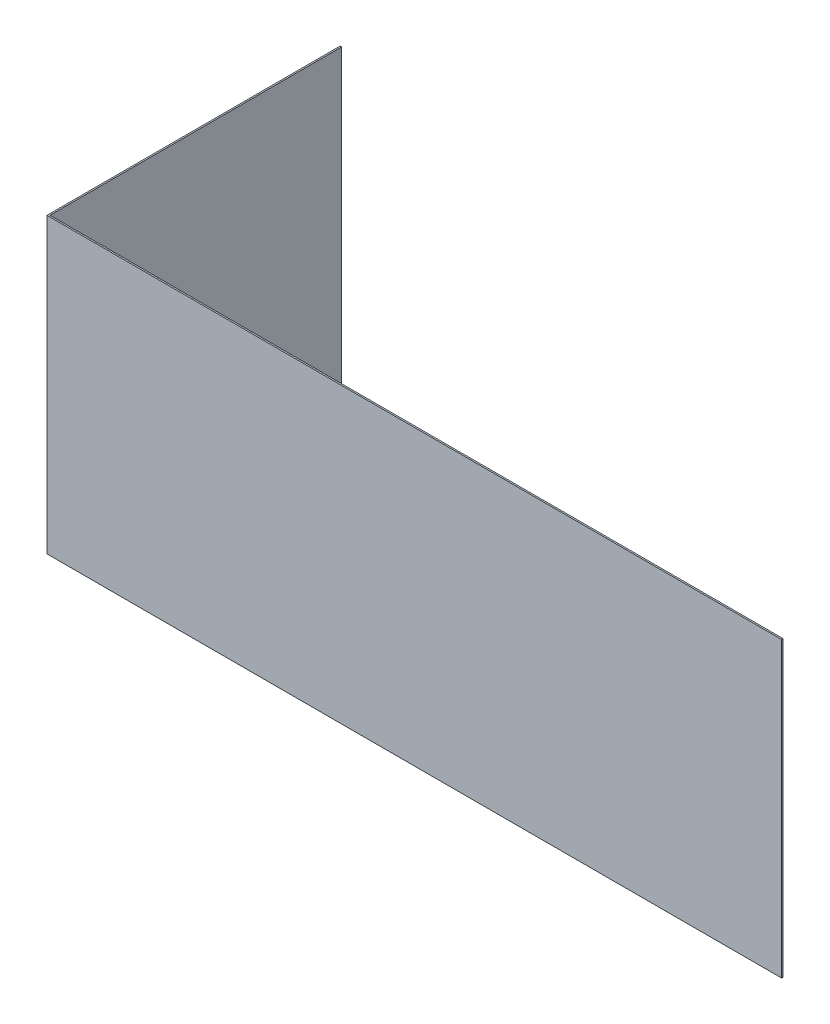
ISO-10303-21;
HEADER;
FILE_DESCRIPTION(('STEP AP214'),'2;1');
FILE_NAME('part.step','',(''),(''),'','','');
FILE_SCHEMA(('AUTOMOTIVE_DESIGN { 1 0 10303 214 1 1 1 1 }'));
ENDSEC;
DATA;
#1=APPLICATION_CONTEXT('core data for automotive mechanical design processes');
#2=APPLICATION_PROTOCOL_DEFINITION('international standard','automotive_design',2000,#1);
#3=PRODUCT_CONTEXT('',#1,'mechanical');
#4=PRODUCT('Part','Part','',(#3));
#5=PRODUCT_RELATED_PRODUCT_CATEGORY('part','',(#4));
#6=PRODUCT_DEFINITION_FORMATION('','',#4);
#7=PRODUCT_DEFINITION_CONTEXT('part definition',#1,'design');
#8=PRODUCT_DEFINITION('design','',#6,#7);
#9=PRODUCT_DEFINITION_SHAPE('','',#8);
#10=(LENGTH_UNIT() NAMED_UNIT(*) SI_UNIT(.MILLI.,.METRE.));
#11=(NAMED_UNIT(*) PLANE_ANGLE_UNIT() SI_UNIT($,.RADIAN.));
#12=(NAMED_UNIT(*) SI_UNIT($,.STERADIAN.) SOLID_ANGLE_UNIT());
#13=UNCERTAINTY_MEASURE_WITH_UNIT(LENGTH_MEASURE(1.E-05),#10,'distance_accuracy_value','');
#14=(GEOMETRIC_REPRESENTATION_CONTEXT(3) GLOBAL_UNCERTAINTY_ASSIGNED_CONTEXT((#13)) GLOBAL_UNIT_ASSIGNED_CONTEXT((#10,
#11,#12)) REPRESENTATION_CONTEXT('',''));
#15=CARTESIAN_POINT('',(0.,0.,0.));
#16=DIRECTION('',(0.,0.,1.));
#17=DIRECTION('',(1.,0.,0.));
#18=AXIS2_PLACEMENT_3D('',#15,#16,#17);
#19=CARTESIAN_POINT('',(9.81116109518429,6.11576115712928,-0.199998744702119));
#20=DIRECTION('',(0.,-8.74227339409092E-08,1.));
#21=DIRECTION('',(-8.74227764510149E-08,-1.,-8.74227339409088E-08));
#22=AXIS2_PLACEMENT_3D('',#19,#20,#21);
#23=PLANE('',#22);
#24=DIRECTION('',(-8.74227764510149E-08,-1.,-8.74227339409088E-08));
#25=VECTOR('',#24,1.);
#26=CARTESIAN_POINT('',(9.81116109518429,6.11576115712928,-0.199998744702119));
#27=LINE('',#26,#25);
#28=CARTESIAN_POINT('',(9.81116109518429,6.11576115712928,-0.199998744702119));
#29=VERTEX_POINT('',#28);
#30=CARTESIAN_POINT('',(9.81116107769975,5.91576115712927,-0.199998762186666));
#31=VERTEX_POINT('',#30);
#32=EDGE_CURVE('E137',#29,#31,#27,.T.);
#33=ORIENTED_EDGE('',*,*,#32,.T.);
#34=DIRECTION('',(-1.,8.74227764510146E-08,0.));
#35=VECTOR('',#34,1.);
#36=CARTESIAN_POINT('',(9.81116107769975,5.91576115712927,-0.199998762186666));
#37=LINE('',#36,#35);
#38=CARTESIAN_POINT('',(9.81016107769975,5.9157611572167,-0.199998762186666));
#39=VERTEX_POINT('',#38);
#40=EDGE_CURVE('E28',#31,#39,#37,.T.);
#41=ORIENTED_EDGE('',*,*,#40,.T.);
#42=DIRECTION('',(-8.74227764510149E-08,-1.,-8.74227339409088E-08));
#43=VECTOR('',#42,1.);
#44=CARTESIAN_POINT('',(9.81016109518429,6.11576115721671,-0.199998744702119));
#45=LINE('',#44,#43);
#46=CARTESIAN_POINT('',(9.81016109518429,6.11576115721671,-0.199998744702119));
#47=VERTEX_POINT('',#46);
#48=EDGE_CURVE('E11',#47,#39,#45,.T.);
#49=ORIENTED_EDGE('',*,*,#48,.F.);
#50=DIRECTION('',(-1.,8.74227764510146E-08,0.));
#51=VECTOR('',#50,1.);
#52=CARTESIAN_POINT('',(9.81016109518429,6.11576115721671,-0.199998744702119));
#53=LINE('',#52,#51);
#54=EDGE_CURVE('E140',#29,#47,#53,.T.);
#55=ORIENTED_EDGE('',*,*,#54,.F.);
#56=EDGE_LOOP('',(#33,#41,#49,#55));
#57=FACE_BOUND('',#56,.T.);
#58=ADVANCED_FACE('F17',(#57),#23,.F.);
#59=CARTESIAN_POINT('',(9.81016107769975,5.91576113973216,1.23781333316933E-06));
#60=DIRECTION('',(1.,-8.74227764510146E-08,0.));
#61=DIRECTION('',(8.74227764510149E-08,1.,8.74227339409088E-08));
#62=AXIS2_PLACEMENT_3D('',#59,#60,#61);
#63=PLANE('',#62);
#64=DIRECTION('',(8.74227764510149E-08,1.,8.74227339409088E-08));
#65=VECTOR('',#64,1.);
#66=CARTESIAN_POINT('',(9.81016107769975,5.91576113973216,1.23781333316933E-06));
#67=LINE('',#66,#65);
#68=CARTESIAN_POINT('',(9.81016107769975,5.91576113973216,1.23781333316933E-06));
#69=VERTEX_POINT('',#68);
#70=CARTESIAN_POINT('',(9.81016109518429,6.11576113973217,1.25529787996584E-06));
#71=VERTEX_POINT('',#70);
#72=EDGE_CURVE('E136',#69,#71,#67,.T.);
#73=ORIENTED_EDGE('',*,*,#72,.T.);
#74=DIRECTION('',(0.,8.74227339409092E-08,-1.));
#75=VECTOR('',#74,1.);
#76=CARTESIAN_POINT('',(9.81016109518429,6.11576113973217,1.25529787996584E-06));
#77=LINE('',#76,#75);
#78=EDGE_CURVE('E98',#71,#47,#77,.T.);
#79=ORIENTED_EDGE('',*,*,#78,.T.);
#80=ORIENTED_EDGE('',*,*,#48,.T.);
#81=DIRECTION('',(0.,8.74227339409092E-08,-1.));
#82=VECTOR('',#81,1.);
#83=CARTESIAN_POINT('',(9.81016107769975,5.91576113973216,1.23781333316933E-06));
#84=LINE('',#83,#82);
#85=EDGE_CURVE('E41',#69,#39,#84,.T.);
#86=ORIENTED_EDGE('',*,*,#85,.F.);
#87=EDGE_LOOP('',(#73,#79,#80,#86));
#88=FACE_BOUND('',#87,.T.);
#89=ADVANCED_FACE('F161',(#88),#63,.F.);
#90=CARTESIAN_POINT('',(9.81116109518429,6.11576113964474,1.25529787996584E-06));
#91=DIRECTION('',(1.,-8.74227764510145E-08,0.));
#92=DIRECTION('',(0.,-8.74227339409093E-08,1.));
#93=AXIS2_PLACEMENT_3D('',#90,#91,#92);
#94=PLANE('',#93);
#95=DIRECTION('',(0.,8.74227339409093E-08,-1.));
#96=VECTOR('',#95,1.);
#97=CARTESIAN_POINT('',(9.81116109518429,6.11576113964474,1.25529787996584E-06));
#98=LINE('',#97,#96);
#99=CARTESIAN_POINT('',(9.81116109518429,6.11576113973217,-0.000998744702120167));
#100=VERTEX_POINT('',#99);
#101=EDGE_CURVE('E150',#100,#29,#98,.T.);
#102=ORIENTED_EDGE('',*,*,#101,.F.);
#103=DIRECTION('',(8.74227764510149E-08,1.,8.74227339409088E-08));
#104=VECTOR('',#103,1.);
#105=CARTESIAN_POINT('',(9.81116109518429,6.11576113973217,-0.000998744702120167));
#106=LINE('',#105,#104);
#107=CARTESIAN_POINT('',(9.81116107769975,5.91576113973216,-0.000998762186666963));
#108=VERTEX_POINT('',#107);
#109=EDGE_CURVE('E153',#108,#100,#106,.T.);
#110=ORIENTED_EDGE('',*,*,#109,.F.);
#111=DIRECTION('',(0.,-8.74227339409093E-08,1.));
#112=VECTOR('',#111,1.);
#113=CARTESIAN_POINT('',(9.81116107769975,5.91576113964473,1.23781333316933E-06));
#114=LINE('',#113,#112);
#115=EDGE_CURVE('E141',#31,#108,#114,.T.);
#116=ORIENTED_EDGE('',*,*,#115,.F.);
#117=ORIENTED_EDGE('',*,*,#32,.F.);
#118=EDGE_LOOP('',(#102,#110,#116,#117));
#119=FACE_BOUND('',#118,.T.);
#120=ADVANCED_FACE('F181',(#119),#94,.T.);
#121=CARTESIAN_POINT('',(9.81016109518429,6.11576113981957,-0.000998744702120167));
#122=DIRECTION('',(0.,-8.74227339409092E-08,1.));
#123=DIRECTION('',(-1.,8.74227764510146E-08,0.));
#124=AXIS2_PLACEMENT_3D('',#121,#122,#123);
#125=PLANE('',#124);
#126=DIRECTION('',(-8.74227764510149E-08,-1.,-8.74227339409088E-08));
#127=VECTOR('',#126,1.);
#128=CARTESIAN_POINT('',(10.3111610951843,6.11576109602077,-0.000998744702123636));
#129=LINE('',#128,#127);
#130=CARTESIAN_POINT('',(10.3111610951843,6.11576109602077,-0.000998744702123636));
#131=VERTEX_POINT('',#130);
#132=CARTESIAN_POINT('',(10.3111610776997,5.91576109602077,-0.000998762186670433));
#133=VERTEX_POINT('',#132);
#134=EDGE_CURVE('E108',#131,#133,#129,.T.);
#135=ORIENTED_EDGE('',*,*,#134,.T.);
#136=DIRECTION('',(-1.,8.74227764510146E-08,0.));
#137=VECTOR('',#136,1.);
#138=CARTESIAN_POINT('',(10.3111610776997,5.91576109602077,-0.000998762186670433));
#139=LINE('',#138,#137);
#140=EDGE_CURVE('E75',#133,#108,#139,.T.);
#141=ORIENTED_EDGE('',*,*,#140,.T.);
#142=ORIENTED_EDGE('',*,*,#109,.T.);
#143=DIRECTION('',(1.,-8.74227764510146E-08,0.));
#144=VECTOR('',#143,1.);
#145=CARTESIAN_POINT('',(9.81016109518429,6.11576113981957,-0.000998744702120167));
#146=LINE('',#145,#144);
#147=EDGE_CURVE('E101',#100,#131,#146,.T.);
#148=ORIENTED_EDGE('',*,*,#147,.T.);
#149=EDGE_LOOP('',(#135,#141,#142,#148));
#150=FACE_BOUND('',#149,.T.);
#151=ADVANCED_FACE('F184',(#150),#125,.F.);
#152=CARTESIAN_POINT('',(9.81016109518429,6.11576113973217,1.25529787996584E-06));
#153=DIRECTION('',(0.,-8.74227339409092E-08,1.));
#154=DIRECTION('',(-1.,8.74227764510146E-08,0.));
#155=AXIS2_PLACEMENT_3D('',#152,#153,#154);
#156=PLANE('',#155);
#157=DIRECTION('',(1.,-8.74227764510146E-08,0.));
#158=VECTOR('',#157,1.);
#159=CARTESIAN_POINT('',(9.81016109518429,6.11576113973217,1.25529787996584E-06));
#160=LINE('',#159,#158);
#161=CARTESIAN_POINT('',(10.3111610951843,6.11576109593334,1.25529787606271E-06));
#162=VERTEX_POINT('',#161);
#163=EDGE_CURVE('E92',#71,#162,#160,.T.);
#164=ORIENTED_EDGE('',*,*,#163,.F.);
#165=ORIENTED_EDGE('',*,*,#72,.F.);
#166=DIRECTION('',(-1.,8.74227764510146E-08,0.));
#167=VECTOR('',#166,1.);
#168=CARTESIAN_POINT('',(10.3111610776997,5.91576109593336,1.2378133292662E-06));
#169=LINE('',#168,#167);
#170=CARTESIAN_POINT('',(10.3111610776997,5.91576109593336,1.2378133292662E-06));
#171=VERTEX_POINT('',#170);
#172=EDGE_CURVE('E86',#171,#69,#169,.T.);
#173=ORIENTED_EDGE('',*,*,#172,.F.);
#174=DIRECTION('',(-8.74227764510149E-08,-1.,-8.74227339409088E-08));
#175=VECTOR('',#174,1.);
#176=CARTESIAN_POINT('',(10.3111610951843,6.11576109593334,1.25529787606271E-06));
#177=LINE('',#176,#175);
#178=EDGE_CURVE('E107',#162,#171,#177,.T.);
#179=ORIENTED_EDGE('',*,*,#178,.F.);
#180=EDGE_LOOP('',(#164,#165,#173,#179));
#181=FACE_BOUND('',#180,.T.);
#182=ADVANCED_FACE('F111',(#181),#156,.T.);
#183=CARTESIAN_POINT('',(10.3111610776997,5.91576109593336,1.2378133292662E-06));
#184=DIRECTION('',(8.74227764510149E-08,1.,8.74227339409088E-08));
#185=DIRECTION('',(-1.,8.74227764510146E-08,0.));
#186=AXIS2_PLACEMENT_3D('',#183,#184,#185);
#187=PLANE('',#186);
#188=ORIENTED_EDGE('',*,*,#172,.T.);
#189=ORIENTED_EDGE('',*,*,#85,.T.);
#190=ORIENTED_EDGE('',*,*,#40,.F.);
#191=ORIENTED_EDGE('',*,*,#115,.T.);
#192=ORIENTED_EDGE('',*,*,#140,.F.);
#193=DIRECTION('',(0.,8.74227339409092E-08,-1.));
#194=VECTOR('',#193,1.);
#195=CARTESIAN_POINT('',(10.3111610776997,5.91576109593336,1.2378133292662E-06));
#196=LINE('',#195,#194);
#197=EDGE_CURVE('E113',#171,#133,#196,.T.);
#198=ORIENTED_EDGE('',*,*,#197,.F.);
#199=EDGE_LOOP('',(#188,#189,#190,#191,#192,#198));
#200=FACE_BOUND('',#199,.T.);
#201=ADVANCED_FACE('F166',(#200),#187,.F.);
#202=CARTESIAN_POINT('',(9.81016109518429,6.11576113973217,1.25529787996584E-06));
#203=DIRECTION('',(-8.74227764510149E-08,-1.,-8.74227339409088E-08));
#204=DIRECTION('',(1.,-8.74227764510146E-08,0.));
#205=AXIS2_PLACEMENT_3D('',#202,#203,#204);
#206=PLANE('',#205);
#207=DIRECTION('',(0.,8.74227339409092E-08,-1.));
#208=VECTOR('',#207,1.);
#209=CARTESIAN_POINT('',(10.3111610951843,6.11576109593334,1.25529787606271E-06));
#210=LINE('',#209,#208);
#211=EDGE_CURVE('E95',#162,#131,#210,.T.);
#212=ORIENTED_EDGE('',*,*,#211,.T.);
#213=ORIENTED_EDGE('',*,*,#147,.F.);
#214=ORIENTED_EDGE('',*,*,#101,.T.);
#215=ORIENTED_EDGE('',*,*,#54,.T.);
#216=ORIENTED_EDGE('',*,*,#78,.F.);
#217=ORIENTED_EDGE('',*,*,#163,.T.);
#218=EDGE_LOOP('',(#212,#213,#214,#215,#216,#217));
#219=FACE_BOUND('',#218,.T.);
#220=ADVANCED_FACE('F19',(#219),#206,.F.);
#221=CARTESIAN_POINT('',(10.3111610951843,6.11576109593334,1.25529787606271E-06));
#222=DIRECTION('',(-1.,8.74227764510146E-08,0.));
#223=DIRECTION('',(-8.74227764510149E-08,-1.,-8.74227339409088E-08));
#224=AXIS2_PLACEMENT_3D('',#221,#222,#223);
#225=PLANE('',#224);
#226=ORIENTED_EDGE('',*,*,#178,.T.);
#227=ORIENTED_EDGE('',*,*,#197,.T.);
#228=ORIENTED_EDGE('',*,*,#134,.F.);
#229=ORIENTED_EDGE('',*,*,#211,.F.);
#230=EDGE_LOOP('',(#226,#227,#228,#229));
#231=FACE_BOUND('',#230,.T.);
#232=ADVANCED_FACE('F105',(#231),#225,.F.);
#233=CLOSED_SHELL('',(#58,#89,#120,#151,#182,#201,#220,#232));
#234=MANIFOLD_SOLID_BREP('B1',#233);
#235=ADVANCED_BREP_SHAPE_REPRESENTATION('',(#18,#234),#14);
#236=SHAPE_DEFINITION_REPRESENTATION(#9,#235);
ENDSEC;
END-ISO-10303-21;
